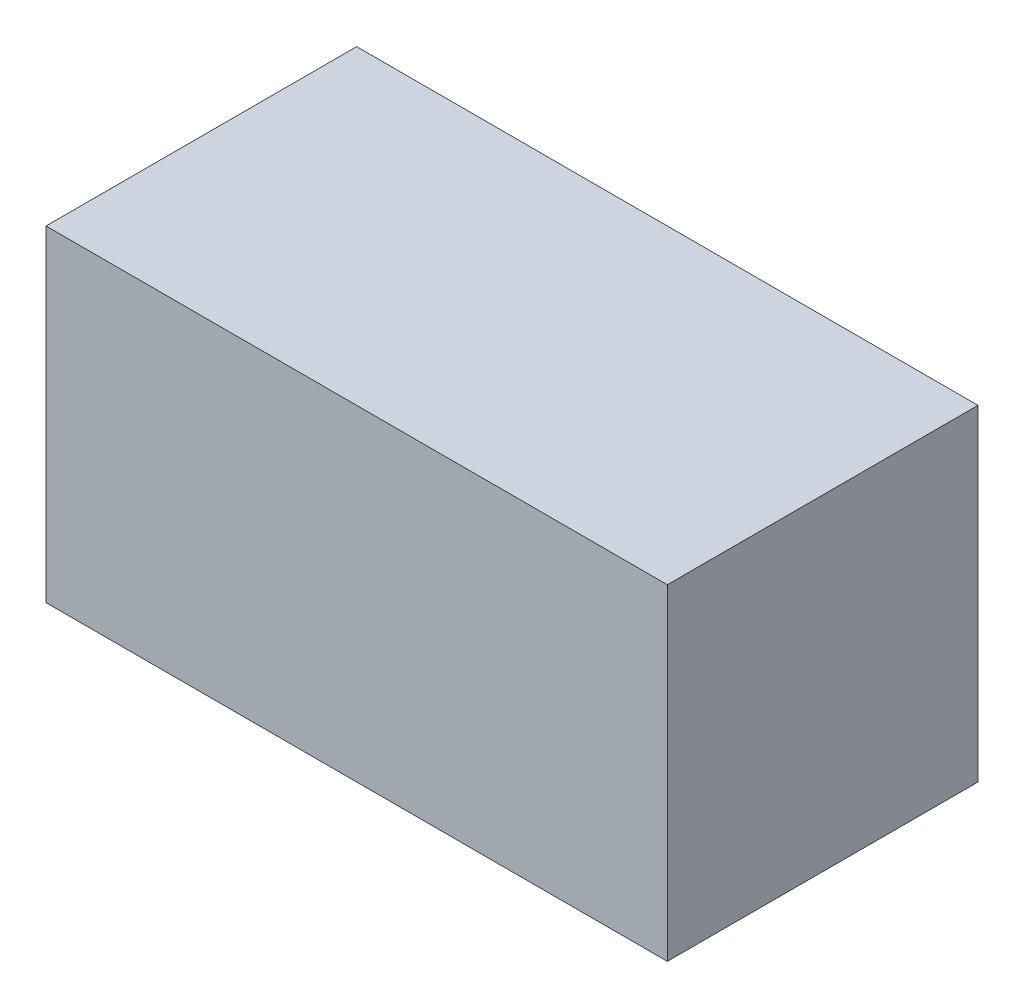
ISO-10303-21;
HEADER;
FILE_DESCRIPTION(('STEP AP214'),'2;1');
FILE_NAME('part.step','',(''),(''),'','','');
FILE_SCHEMA(('AUTOMOTIVE_DESIGN { 1 0 10303 214 1 1 1 1 }'));
ENDSEC;
DATA;
#1=APPLICATION_CONTEXT('core data for automotive mechanical design processes');
#2=APPLICATION_PROTOCOL_DEFINITION('international standard','automotive_design',2000,#1);
#3=PRODUCT_CONTEXT('',#1,'mechanical');
#4=PRODUCT('Part','Part','',(#3));
#5=PRODUCT_RELATED_PRODUCT_CATEGORY('part','',(#4));
#6=PRODUCT_DEFINITION_FORMATION('','',#4);
#7=PRODUCT_DEFINITION_CONTEXT('part definition',#1,'design');
#8=PRODUCT_DEFINITION('design','',#6,#7);
#9=PRODUCT_DEFINITION_SHAPE('','',#8);
#10=(LENGTH_UNIT() NAMED_UNIT(*) SI_UNIT(.MILLI.,.METRE.));
#11=(NAMED_UNIT(*) PLANE_ANGLE_UNIT() SI_UNIT($,.RADIAN.));
#12=(NAMED_UNIT(*) SI_UNIT($,.STERADIAN.) SOLID_ANGLE_UNIT());
#13=UNCERTAINTY_MEASURE_WITH_UNIT(LENGTH_MEASURE(1.E-05),#10,'distance_accuracy_value','');
#14=(GEOMETRIC_REPRESENTATION_CONTEXT(3) GLOBAL_UNCERTAINTY_ASSIGNED_CONTEXT((#13)) GLOBAL_UNIT_ASSIGNED_CONTEXT((#10,
#11,#12)) REPRESENTATION_CONTEXT('',''));
#15=CARTESIAN_POINT('',(0.,0.,0.));
#16=DIRECTION('',(0.,0.,1.));
#17=DIRECTION('',(1.,0.,0.));
#18=AXIS2_PLACEMENT_3D('',#15,#16,#17);
#19=CARTESIAN_POINT('',(-21.5,3.5,2.95));
#20=DIRECTION('',(-0.0871557427476582,0.,0.996194698091746));
#21=DIRECTION('',(0.996194698091746,0.,0.0871557427476582));
#22=AXIS2_PLACEMENT_3D('',#19,#20,#21);
#23=PLANE('',#22);
#24=DIRECTION('',(0.,1.,0.));
#25=VECTOR('',#24,1.);
#26=CARTESIAN_POINT('',(-21.5,3.5,2.95));
#27=LINE('',#26,#25);
#28=CARTESIAN_POINT('',(-21.5,0.5,2.95));
#29=VERTEX_POINT('',#28);
#30=CARTESIAN_POINT('',(-21.5,3.5,2.95));
#31=VERTEX_POINT('',#30);
#32=EDGE_CURVE('E88',#29,#31,#27,.T.);
#33=ORIENTED_EDGE('',*,*,#32,.T.);
#34=DIRECTION('',(0.992432509138967,0.0868265938642476,0.0868265938642476));
#35=VECTOR('',#34,1.);
#36=CARTESIAN_POINT('',(-22.0084002530112,3.4555207413278,2.90552074132781));
#37=LINE('',#36,#35);
#38=CARTESIAN_POINT('',(-25.2,3.17629194495408,2.62629194495408));
#39=VERTEX_POINT('',#38);
#40=EDGE_CURVE('E12',#39,#31,#37,.T.);
#41=ORIENTED_EDGE('',*,*,#40,.F.);
#42=DIRECTION('',(0.,-1.,0.));
#43=VECTOR('',#42,1.);
#44=CARTESIAN_POINT('',(-25.2,3.5,2.62629194495408));
#45=LINE('',#44,#43);
#46=CARTESIAN_POINT('',(-25.2,0.823708055045919,2.62629194495408));
#47=VERTEX_POINT('',#46);
#48=EDGE_CURVE('E104',#47,#39,#45,.F.);
#49=ORIENTED_EDGE('',*,*,#48,.F.);
#50=DIRECTION('',(0.992432509138967,-0.0868265938642476,0.0868265938642477));
#51=VECTOR('',#50,1.);
#52=CARTESIAN_POINT('',(-21.7585086032261,0.5226165722062,2.9273834277938));
#53=LINE('',#52,#51);
#54=EDGE_CURVE('E99',#47,#29,#53,.T.);
#55=ORIENTED_EDGE('',*,*,#54,.T.);
#56=EDGE_LOOP('',(#33,#41,#49,#55));
#57=FACE_BOUND('',#56,.T.);
#58=ADVANCED_FACE('F42',(#57),#23,.T.);
#59=CARTESIAN_POINT('',(-21.5,3.5,-2.95));
#60=DIRECTION('',(-0.0871557427476582,0.996194698091746,0.));
#61=DIRECTION('',(-0.996194698091746,-0.0871557427476582,0.));
#62=AXIS2_PLACEMENT_3D('',#59,#60,#61);
#63=PLANE('',#62);
#64=DIRECTION('',(0.,0.,-1.));
#65=VECTOR('',#64,1.);
#66=CARTESIAN_POINT('',(-21.5,3.5,-2.95));
#67=LINE('',#66,#65);
#68=CARTESIAN_POINT('',(-21.5,3.5,-2.95));
#69=VERTEX_POINT('',#68);
#70=EDGE_CURVE('E84',#31,#69,#67,.T.);
#71=ORIENTED_EDGE('',*,*,#70,.T.);
#72=DIRECTION('',(0.992432509138967,0.0868265938642476,-0.0868265938642477));
#73=VECTOR('',#72,1.);
#74=CARTESIAN_POINT('',(-21.5,3.5,-2.95));
#75=LINE('',#74,#73);
#76=CARTESIAN_POINT('',(-25.2,3.17629194495408,-2.62629194495408));
#77=VERTEX_POINT('',#76);
#78=EDGE_CURVE('E51',#77,#69,#75,.T.);
#79=ORIENTED_EDGE('',*,*,#78,.F.);
#80=DIRECTION('',(0.,0.,1.));
#81=VECTOR('',#80,1.);
#82=CARTESIAN_POINT('',(-25.2,3.17629194495408,-2.95));
#83=LINE('',#82,#81);
#84=EDGE_CURVE('E95',#39,#77,#83,.F.);
#85=ORIENTED_EDGE('',*,*,#84,.F.);
#86=ORIENTED_EDGE('',*,*,#40,.T.);
#87=EDGE_LOOP('',(#71,#79,#85,#86));
#88=FACE_BOUND('',#87,.T.);
#89=ADVANCED_FACE('F44',(#88),#63,.T.);
#90=CARTESIAN_POINT('',(-21.5,3.5,-2.95));
#91=DIRECTION('',(-0.0871557427476582,0.,-0.996194698091746));
#92=DIRECTION('',(-0.996194698091746,0.,0.0871557427476582));
#93=AXIS2_PLACEMENT_3D('',#90,#91,#92);
#94=PLANE('',#93);
#95=DIRECTION('',(0.,-1.,0.));
#96=VECTOR('',#95,1.);
#97=CARTESIAN_POINT('',(-21.5,3.5,-2.95));
#98=LINE('',#97,#96);
#99=CARTESIAN_POINT('',(-21.5,0.5,-2.95));
#100=VERTEX_POINT('',#99);
#101=EDGE_CURVE('E89',#69,#100,#98,.T.);
#102=ORIENTED_EDGE('',*,*,#101,.T.);
#103=DIRECTION('',(0.992432509138967,-0.0868265938642476,-0.0868265938642476));
#104=VECTOR('',#103,1.);
#105=CARTESIAN_POINT('',(-21.5,0.5,-2.95));
#106=LINE('',#105,#104);
#107=CARTESIAN_POINT('',(-25.2,0.823708055045919,-2.62629194495408));
#108=VERTEX_POINT('',#107);
#109=EDGE_CURVE('E107',#108,#100,#106,.T.);
#110=ORIENTED_EDGE('',*,*,#109,.F.);
#111=DIRECTION('',(0.,1.,0.));
#112=VECTOR('',#111,1.);
#113=CARTESIAN_POINT('',(-25.2,3.5,-2.62629194495408));
#114=LINE('',#113,#112);
#115=EDGE_CURVE('E63',#77,#108,#114,.F.);
#116=ORIENTED_EDGE('',*,*,#115,.F.);
#117=ORIENTED_EDGE('',*,*,#78,.T.);
#118=EDGE_LOOP('',(#102,#110,#116,#117));
#119=FACE_BOUND('',#118,.T.);
#120=ADVANCED_FACE('F114',(#119),#94,.T.);
#121=CARTESIAN_POINT('',(-21.5,0.5,-2.95));
#122=DIRECTION('',(-0.0871557427476582,-0.996194698091746,0.));
#123=DIRECTION('',(0.996194698091746,-0.0871557427476582,0.));
#124=AXIS2_PLACEMENT_3D('',#121,#122,#123);
#125=PLANE('',#124);
#126=DIRECTION('',(0.,0.,1.));
#127=VECTOR('',#126,1.);
#128=CARTESIAN_POINT('',(-21.5,0.5,-2.95));
#129=LINE('',#128,#127);
#130=EDGE_CURVE('E103',#100,#29,#129,.T.);
#131=ORIENTED_EDGE('',*,*,#130,.T.);
#132=ORIENTED_EDGE('',*,*,#54,.F.);
#133=DIRECTION('',(0.,0.,-1.));
#134=VECTOR('',#133,1.);
#135=CARTESIAN_POINT('',(-25.2,0.823708055045919,-2.95));
#136=LINE('',#135,#134);
#137=EDGE_CURVE('E46',#108,#47,#136,.F.);
#138=ORIENTED_EDGE('',*,*,#137,.F.);
#139=ORIENTED_EDGE('',*,*,#109,.T.);
#140=EDGE_LOOP('',(#131,#132,#138,#139));
#141=FACE_BOUND('',#140,.T.);
#142=ADVANCED_FACE('F116',(#141),#125,.T.);
#143=CARTESIAN_POINT('',(-25.2,0.,0.));
#144=DIRECTION('',(-1.,0.,0.));
#145=DIRECTION('',(0.,0.,1.));
#146=AXIS2_PLACEMENT_3D('',#143,#144,#145);
#147=PLANE('',#146);
#148=ORIENTED_EDGE('',*,*,#48,.T.);
#149=ORIENTED_EDGE('',*,*,#84,.T.);
#150=ORIENTED_EDGE('',*,*,#115,.T.);
#151=ORIENTED_EDGE('',*,*,#137,.T.);
#152=EDGE_LOOP('',(#148,#149,#150,#151));
#153=FACE_BOUND('',#152,.T.);
#154=ADVANCED_FACE('F112',(#153),#147,.T.);
#155=CARTESIAN_POINT('',(-21.5,0.,0.));
#156=DIRECTION('',(-1.,0.,0.));
#157=DIRECTION('',(0.,0.,1.));
#158=AXIS2_PLACEMENT_3D('',#155,#156,#157);
#159=PLANE('',#158);
#160=ORIENTED_EDGE('',*,*,#32,.F.);
#161=ORIENTED_EDGE('',*,*,#130,.F.);
#162=ORIENTED_EDGE('',*,*,#101,.F.);
#163=ORIENTED_EDGE('',*,*,#70,.F.);
#164=EDGE_LOOP('',(#160,#161,#162,#163));
#165=FACE_BOUND('',#164,.T.);
#166=ADVANCED_FACE('F85',(#165),#159,.F.);
#167=CLOSED_SHELL('',(#58,#89,#120,#142,#154,#166));
#168=MANIFOLD_SOLID_BREP('B2',#167);
#169=CARTESIAN_POINT('',(-20.,21.,10.));
#170=DIRECTION('',(1.,0.,0.));
#171=DIRECTION('',(0.,0.,-1.));
#172=AXIS2_PLACEMENT_3D('',#169,#170,#171);
#173=PLANE('',#172);
#174=DIRECTION('',(0.,-1.,0.));
#175=VECTOR('',#174,1.);
#176=CARTESIAN_POINT('',(-20.,0.,-3.45));
#177=LINE('',#176,#175);
#178=CARTESIAN_POINT('',(-20.,4.,-3.45));
#179=VERTEX_POINT('',#178);
#180=CARTESIAN_POINT('',(-20.,0.,-3.45));
#181=VERTEX_POINT('',#180);
#182=EDGE_CURVE('E180',#179,#181,#177,.T.);
#183=ORIENTED_EDGE('',*,*,#182,.F.);
#184=DIRECTION('',(0.,0.,-1.));
#185=VECTOR('',#184,1.);
#186=CARTESIAN_POINT('',(-20.,4.,-3.45));
#187=LINE('',#186,#185);
#188=CARTESIAN_POINT('',(-20.,4.,3.45));
#189=VERTEX_POINT('',#188);
#190=EDGE_CURVE('E250',#189,#179,#187,.T.);
#191=ORIENTED_EDGE('',*,*,#190,.F.);
#192=DIRECTION('',(0.,1.,0.));
#193=VECTOR('',#192,1.);
#194=CARTESIAN_POINT('',(-20.,0.,3.45));
#195=LINE('',#194,#193);
#196=CARTESIAN_POINT('',(-20.,0.,3.45));
#197=VERTEX_POINT('',#196);
#198=EDGE_CURVE('E186',#197,#189,#195,.T.);
#199=ORIENTED_EDGE('',*,*,#198,.F.);
#200=DIRECTION('',(0.,0.,1.));
#201=VECTOR('',#200,1.);
#202=CARTESIAN_POINT('',(-20.,0.,10.));
#203=LINE('',#202,#201);
#204=CARTESIAN_POINT('',(-20.,0.,10.));
#205=VERTEX_POINT('',#204);
#206=EDGE_CURVE('E274',#197,#205,#203,.T.);
#207=ORIENTED_EDGE('',*,*,#206,.T.);
#208=DIRECTION('',(0.,-1.,0.));
#209=VECTOR('',#208,1.);
#210=CARTESIAN_POINT('',(-20.,21.,10.));
#211=LINE('',#210,#209);
#212=CARTESIAN_POINT('',(-20.,21.,10.));
#213=VERTEX_POINT('',#212);
#214=EDGE_CURVE('E280',#213,#205,#211,.T.);
#215=ORIENTED_EDGE('',*,*,#214,.F.);
#216=DIRECTION('',(0.,0.,1.));
#217=VECTOR('',#216,1.);
#218=CARTESIAN_POINT('',(-20.,21.,10.));
#219=LINE('',#218,#217);
#220=CARTESIAN_POINT('',(-20.,21.,-10.));
#221=VERTEX_POINT('',#220);
#222=EDGE_CURVE('E268',#221,#213,#219,.T.);
#223=ORIENTED_EDGE('',*,*,#222,.F.);
#224=DIRECTION('',(0.,-1.,0.));
#225=VECTOR('',#224,1.);
#226=CARTESIAN_POINT('',(-20.,21.,-10.));
#227=LINE('',#226,#225);
#228=CARTESIAN_POINT('',(-20.,0.,-10.));
#229=VERTEX_POINT('',#228);
#230=EDGE_CURVE('E173',#221,#229,#227,.T.);
#231=ORIENTED_EDGE('',*,*,#230,.T.);
#232=EDGE_CURVE('E275',#229,#181,#203,.T.);
#233=ORIENTED_EDGE('',*,*,#232,.T.);
#234=EDGE_LOOP('',(#183,#191,#199,#207,#215,#223,#231,#233));
#235=FACE_BOUND('',#234,.T.);
#236=ADVANCED_FACE('F165',(#235),#173,.F.);
#237=CARTESIAN_POINT('',(20.,21.,10.));
#238=DIRECTION('',(-1.,0.,0.));
#239=DIRECTION('',(0.,0.,1.));
#240=AXIS2_PLACEMENT_3D('',#237,#238,#239);
#241=PLANE('',#240);
#242=DIRECTION('',(0.,0.,-1.));
#243=VECTOR('',#242,1.);
#244=CARTESIAN_POINT('',(20.,0.,10.));
#245=LINE('',#244,#243);
#246=CARTESIAN_POINT('',(20.,0.,10.));
#247=VERTEX_POINT('',#246);
#248=CARTESIAN_POINT('',(20.,0.,-10.));
#249=VERTEX_POINT('',#248);
#250=EDGE_CURVE('E253',#247,#249,#245,.T.);
#251=ORIENTED_EDGE('',*,*,#250,.T.);
#252=DIRECTION('',(0.,-1.,0.));
#253=VECTOR('',#252,1.);
#254=CARTESIAN_POINT('',(20.,21.,-10.));
#255=LINE('',#254,#253);
#256=CARTESIAN_POINT('',(20.,21.,-10.));
#257=VERTEX_POINT('',#256);
#258=EDGE_CURVE('E40',#257,#249,#255,.T.);
#259=ORIENTED_EDGE('',*,*,#258,.F.);
#260=DIRECTION('',(0.,0.,-1.));
#261=VECTOR('',#260,1.);
#262=CARTESIAN_POINT('',(20.,21.,10.));
#263=LINE('',#262,#261);
#264=CARTESIAN_POINT('',(20.,21.,10.));
#265=VERTEX_POINT('',#264);
#266=EDGE_CURVE('E262',#265,#257,#263,.T.);
#267=ORIENTED_EDGE('',*,*,#266,.F.);
#268=DIRECTION('',(0.,-1.,0.));
#269=VECTOR('',#268,1.);
#270=CARTESIAN_POINT('',(20.,21.,10.));
#271=LINE('',#270,#269);
#272=EDGE_CURVE('E271',#265,#247,#271,.T.);
#273=ORIENTED_EDGE('',*,*,#272,.T.);
#274=EDGE_LOOP('',(#251,#259,#267,#273));
#275=FACE_BOUND('',#274,.T.);
#276=ADVANCED_FACE('F167',(#275),#241,.F.);
#277=CARTESIAN_POINT('',(-20.,21.,-10.));
#278=DIRECTION('',(0.,0.,1.));
#279=DIRECTION('',(1.,0.,0.));
#280=AXIS2_PLACEMENT_3D('',#277,#278,#279);
#281=PLANE('',#280);
#282=DIRECTION('',(-1.,0.,0.));
#283=VECTOR('',#282,1.);
#284=CARTESIAN_POINT('',(-20.,0.,-10.));
#285=LINE('',#284,#283);
#286=EDGE_CURVE('E256',#249,#229,#285,.T.);
#287=ORIENTED_EDGE('',*,*,#286,.T.);
#288=ORIENTED_EDGE('',*,*,#230,.F.);
#289=DIRECTION('',(-1.,0.,0.));
#290=VECTOR('',#289,1.);
#291=CARTESIAN_POINT('',(-20.,21.,-10.));
#292=LINE('',#291,#290);
#293=EDGE_CURVE('E265',#257,#221,#292,.T.);
#294=ORIENTED_EDGE('',*,*,#293,.F.);
#295=ORIENTED_EDGE('',*,*,#258,.T.);
#296=EDGE_LOOP('',(#287,#288,#294,#295));
#297=FACE_BOUND('',#296,.T.);
#298=ADVANCED_FACE('F289',(#297),#281,.F.);
#299=CARTESIAN_POINT('',(-20.,21.,10.));
#300=DIRECTION('',(0.,0.,-1.));
#301=DIRECTION('',(-1.,0.,0.));
#302=AXIS2_PLACEMENT_3D('',#299,#300,#301);
#303=PLANE('',#302);
#304=DIRECTION('',(1.,0.,0.));
#305=VECTOR('',#304,1.);
#306=CARTESIAN_POINT('',(-20.,0.,10.));
#307=LINE('',#306,#305);
#308=EDGE_CURVE('E266',#205,#247,#307,.T.);
#309=ORIENTED_EDGE('',*,*,#308,.T.);
#310=ORIENTED_EDGE('',*,*,#272,.F.);
#311=DIRECTION('',(1.,0.,0.));
#312=VECTOR('',#311,1.);
#313=CARTESIAN_POINT('',(-20.,21.,10.));
#314=LINE('',#313,#312);
#315=EDGE_CURVE('E270',#213,#265,#314,.T.);
#316=ORIENTED_EDGE('',*,*,#315,.F.);
#317=ORIENTED_EDGE('',*,*,#214,.T.);
#318=EDGE_LOOP('',(#309,#310,#316,#317));
#319=FACE_BOUND('',#318,.T.);
#320=ADVANCED_FACE('F295',(#319),#303,.F.);
#321=CARTESIAN_POINT('',(0.,21.,0.));
#322=DIRECTION('',(0.,-1.,0.));
#323=DIRECTION('',(0.,0.,-1.));
#324=AXIS2_PLACEMENT_3D('',#321,#322,#323);
#325=PLANE('',#324);
#326=ORIENTED_EDGE('',*,*,#266,.T.);
#327=ORIENTED_EDGE('',*,*,#293,.T.);
#328=ORIENTED_EDGE('',*,*,#222,.T.);
#329=ORIENTED_EDGE('',*,*,#315,.T.);
#330=EDGE_LOOP('',(#326,#327,#328,#329));
#331=FACE_BOUND('',#330,.T.);
#332=ADVANCED_FACE('F328',(#331),#325,.F.);
#333=CARTESIAN_POINT('',(0.,0.,0.));
#334=DIRECTION('',(0.,-1.,0.));
#335=DIRECTION('',(0.,0.,-1.));
#336=AXIS2_PLACEMENT_3D('',#333,#334,#335);
#337=PLANE('',#336);
#338=ORIENTED_EDGE('',*,*,#250,.F.);
#339=ORIENTED_EDGE('',*,*,#308,.F.);
#340=ORIENTED_EDGE('',*,*,#206,.F.);
#341=DIRECTION('',(1.,0.,0.));
#342=VECTOR('',#341,1.);
#343=CARTESIAN_POINT('',(-21.5,0.,3.45));
#344=LINE('',#343,#342);
#345=CARTESIAN_POINT('',(-21.5,0.,3.45));
#346=VERTEX_POINT('',#345);
#347=EDGE_CURVE('E237',#346,#197,#344,.T.);
#348=ORIENTED_EDGE('',*,*,#347,.F.);
#349=DIRECTION('',(0.,0.,1.));
#350=VECTOR('',#349,1.);
#351=CARTESIAN_POINT('',(-21.5,0.,-3.45));
#352=LINE('',#351,#350);
#353=CARTESIAN_POINT('',(-21.5,0.,-3.45));
#354=VERTEX_POINT('',#353);
#355=EDGE_CURVE('E229',#354,#346,#352,.T.);
#356=ORIENTED_EDGE('',*,*,#355,.F.);
#357=DIRECTION('',(1.,0.,0.));
#358=VECTOR('',#357,1.);
#359=CARTESIAN_POINT('',(-21.5,0.,-3.45));
#360=LINE('',#359,#358);
#361=EDGE_CURVE('E235',#354,#181,#360,.T.);
#362=ORIENTED_EDGE('',*,*,#361,.T.);
#363=ORIENTED_EDGE('',*,*,#232,.F.);
#364=ORIENTED_EDGE('',*,*,#286,.F.);
#365=EDGE_LOOP('',(#338,#339,#340,#348,#356,#362,#363,#364));
#366=FACE_BOUND('',#365,.T.);
#367=ADVANCED_FACE('F232',(#366),#337,.T.);
#368=CARTESIAN_POINT('',(-21.5,0.,-3.45));
#369=DIRECTION('',(0.,0.,1.));
#370=DIRECTION('',(0.,-1.,0.));
#371=AXIS2_PLACEMENT_3D('',#368,#369,#370);
#372=PLANE('',#371);
#373=ORIENTED_EDGE('',*,*,#182,.T.);
#374=ORIENTED_EDGE('',*,*,#361,.F.);
#375=DIRECTION('',(0.,-1.,0.));
#376=VECTOR('',#375,1.);
#377=CARTESIAN_POINT('',(-21.5,0.,-3.45));
#378=LINE('',#377,#376);
#379=CARTESIAN_POINT('',(-21.5,4.,-3.45));
#380=VERTEX_POINT('',#379);
#381=EDGE_CURVE('E241',#380,#354,#378,.T.);
#382=ORIENTED_EDGE('',*,*,#381,.F.);
#383=DIRECTION('',(1.,0.,0.));
#384=VECTOR('',#383,1.);
#385=CARTESIAN_POINT('',(-21.5,4.,-3.45));
#386=LINE('',#385,#384);
#387=EDGE_CURVE('E301',#380,#179,#386,.T.);
#388=ORIENTED_EDGE('',*,*,#387,.T.);
#389=EDGE_LOOP('',(#373,#374,#382,#388));
#390=FACE_BOUND('',#389,.T.);
#391=ADVANCED_FACE('F252',(#390),#372,.F.);
#392=CARTESIAN_POINT('',(-21.5,0.,3.45));
#393=DIRECTION('',(0.,0.,-1.));
#394=DIRECTION('',(0.,1.,0.));
#395=AXIS2_PLACEMENT_3D('',#392,#393,#394);
#396=PLANE('',#395);
#397=ORIENTED_EDGE('',*,*,#198,.T.);
#398=DIRECTION('',(1.,0.,0.));
#399=VECTOR('',#398,1.);
#400=CARTESIAN_POINT('',(-21.5,4.,3.45));
#401=LINE('',#400,#399);
#402=CARTESIAN_POINT('',(-21.5,4.,3.45));
#403=VERTEX_POINT('',#402);
#404=EDGE_CURVE('E258',#403,#189,#401,.T.);
#405=ORIENTED_EDGE('',*,*,#404,.F.);
#406=DIRECTION('',(0.,1.,0.));
#407=VECTOR('',#406,1.);
#408=CARTESIAN_POINT('',(-21.5,0.,3.45));
#409=LINE('',#408,#407);
#410=EDGE_CURVE('E240',#346,#403,#409,.T.);
#411=ORIENTED_EDGE('',*,*,#410,.F.);
#412=ORIENTED_EDGE('',*,*,#347,.T.);
#413=EDGE_LOOP('',(#397,#405,#411,#412));
#414=FACE_BOUND('',#413,.T.);
#415=ADVANCED_FACE('F297',(#414),#396,.F.);
#416=CARTESIAN_POINT('',(-21.5,4.,-3.45));
#417=DIRECTION('',(0.,-1.,0.));
#418=DIRECTION('',(0.,0.,-1.));
#419=AXIS2_PLACEMENT_3D('',#416,#417,#418);
#420=PLANE('',#419);
#421=ORIENTED_EDGE('',*,*,#190,.T.);
#422=ORIENTED_EDGE('',*,*,#387,.F.);
#423=DIRECTION('',(0.,0.,-1.));
#424=VECTOR('',#423,1.);
#425=CARTESIAN_POINT('',(-21.5,4.,-3.45));
#426=LINE('',#425,#424);
#427=EDGE_CURVE('E246',#403,#380,#426,.T.);
#428=ORIENTED_EDGE('',*,*,#427,.F.);
#429=ORIENTED_EDGE('',*,*,#404,.T.);
#430=EDGE_LOOP('',(#421,#422,#428,#429));
#431=FACE_BOUND('',#430,.T.);
#432=ADVANCED_FACE('F308',(#431),#420,.F.);
#433=CARTESIAN_POINT('',(-21.5,0.,0.));
#434=DIRECTION('',(1.,0.,0.));
#435=DIRECTION('',(0.,0.,-1.));
#436=AXIS2_PLACEMENT_3D('',#433,#434,#435);
#437=PLANE('',#436);
#438=ORIENTED_EDGE('',*,*,#381,.T.);
#439=ORIENTED_EDGE('',*,*,#355,.T.);
#440=ORIENTED_EDGE('',*,*,#410,.T.);
#441=ORIENTED_EDGE('',*,*,#427,.T.);
#442=EDGE_LOOP('',(#438,#439,#440,#441));
#443=FACE_BOUND('',#442,.T.);
#444=ADVANCED_FACE('F244',(#443),#437,.F.);
#445=CLOSED_SHELL('',(#236,#276,#298,#320,#332,#367,#391,#415,#432,#444));
#446=MANIFOLD_SOLID_BREP('B6',#445);
#447=ADVANCED_BREP_SHAPE_REPRESENTATION('',(#18,#168,#446),#14);
#448=SHAPE_DEFINITION_REPRESENTATION(#9,#447);
ENDSEC;
END-ISO-10303-21;
